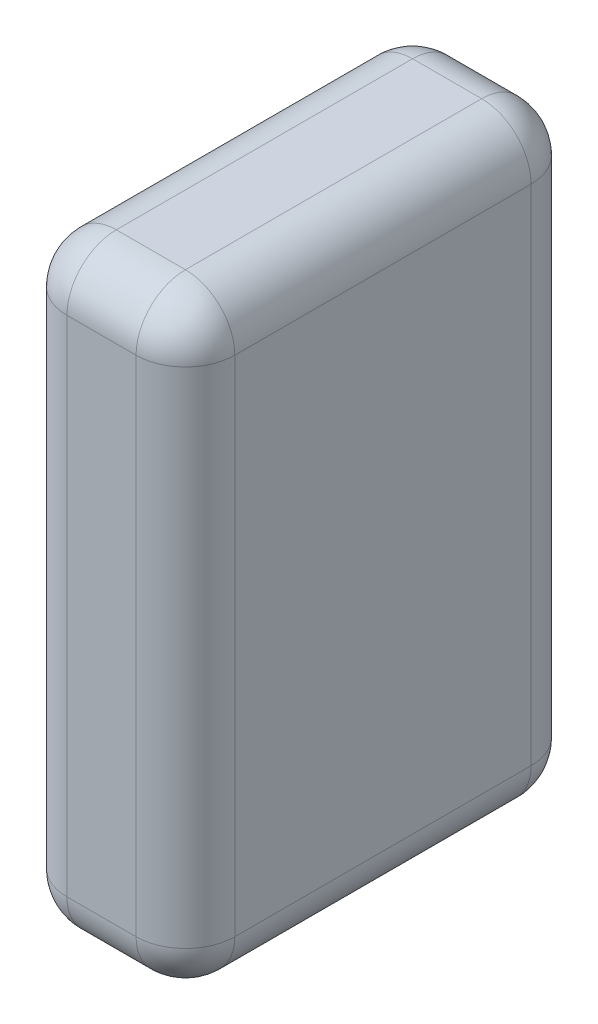
ISO-10303-21;
HEADER;
FILE_DESCRIPTION(('STEP AP214'),'2;1');
FILE_NAME('part.step','',(''),(''),'','','');
FILE_SCHEMA(('AUTOMOTIVE_DESIGN { 1 0 10303 214 1 1 1 1 }'));
ENDSEC;
DATA;
#1=APPLICATION_CONTEXT('core data for automotive mechanical design processes');
#2=APPLICATION_PROTOCOL_DEFINITION('international standard','automotive_design',2000,#1);
#3=PRODUCT_CONTEXT('',#1,'mechanical');
#4=PRODUCT('Part','Part','',(#3));
#5=PRODUCT_RELATED_PRODUCT_CATEGORY('part','',(#4));
#6=PRODUCT_DEFINITION_FORMATION('','',#4);
#7=PRODUCT_DEFINITION_CONTEXT('part definition',#1,'design');
#8=PRODUCT_DEFINITION('design','',#6,#7);
#9=PRODUCT_DEFINITION_SHAPE('','',#8);
#10=(LENGTH_UNIT() NAMED_UNIT(*) SI_UNIT(.MILLI.,.METRE.));
#11=(NAMED_UNIT(*) PLANE_ANGLE_UNIT() SI_UNIT($,.RADIAN.));
#12=(NAMED_UNIT(*) SI_UNIT($,.STERADIAN.) SOLID_ANGLE_UNIT());
#13=UNCERTAINTY_MEASURE_WITH_UNIT(LENGTH_MEASURE(1.E-05),#10,'distance_accuracy_value','');
#14=(GEOMETRIC_REPRESENTATION_CONTEXT(3) GLOBAL_UNCERTAINTY_ASSIGNED_CONTEXT((#13)) GLOBAL_UNIT_ASSIGNED_CONTEXT((#10,
#11,#12)) REPRESENTATION_CONTEXT('',''));
#15=CARTESIAN_POINT('',(0.,0.,0.));
#16=DIRECTION('',(0.,0.,1.));
#17=DIRECTION('',(1.,0.,0.));
#18=AXIS2_PLACEMENT_3D('',#15,#16,#17);
#19=CARTESIAN_POINT('',(-8.49999999999999,-30.5,40.));
#20=DIRECTION('',(1.,0.,0.));
#21=DIRECTION('',(0.,0.,-1.));
#22=AXIS2_PLACEMENT_3D('',#19,#20,#21);
#23=PLANE('',#22);
#24=DIRECTION('',(0.,0.,-1.));
#25=VECTOR('',#24,1.);
#26=CARTESIAN_POINT('',(-8.49999999999999,25.5,40.));
#27=LINE('',#26,#25);
#28=CARTESIAN_POINT('',(-8.49999999999999,25.5,35.));
#29=VERTEX_POINT('',#28);
#30=CARTESIAN_POINT('',(-8.49999999999999,25.5,5.));
#31=VERTEX_POINT('',#30);
#32=EDGE_CURVE('E146',#29,#31,#27,.T.);
#33=ORIENTED_EDGE('',*,*,#32,.T.);
#34=DIRECTION('',(0.,-1.,0.));
#35=VECTOR('',#34,1.);
#36=CARTESIAN_POINT('',(-8.49999999999999,-30.5,5.));
#37=LINE('',#36,#35);
#38=CARTESIAN_POINT('',(-8.49999999999999,-25.5,5.));
#39=VERTEX_POINT('',#38);
#40=EDGE_CURVE('E141',#31,#39,#37,.T.);
#41=ORIENTED_EDGE('',*,*,#40,.T.);
#42=DIRECTION('',(0.,0.,-1.));
#43=VECTOR('',#42,1.);
#44=CARTESIAN_POINT('',(-8.49999999999999,-25.5,40.));
#45=LINE('',#44,#43);
#46=CARTESIAN_POINT('',(-8.49999999999999,-25.5,35.));
#47=VERTEX_POINT('',#46);
#48=EDGE_CURVE('E136',#39,#47,#45,.F.);
#49=ORIENTED_EDGE('',*,*,#48,.T.);
#50=DIRECTION('',(0.,-1.,0.));
#51=VECTOR('',#50,1.);
#52=CARTESIAN_POINT('',(-8.49999999999999,30.5,35.));
#53=LINE('',#52,#51);
#54=EDGE_CURVE('E138',#47,#29,#53,.F.);
#55=ORIENTED_EDGE('',*,*,#54,.T.);
#56=EDGE_LOOP('',(#33,#41,#49,#55));
#57=FACE_BOUND('',#56,.T.);
#58=ADVANCED_FACE('F43',(#57),#23,.F.);
#59=CARTESIAN_POINT('',(8.50000000000001,-30.5,40.));
#60=DIRECTION('',(0.,1.,0.));
#61=DIRECTION('',(0.,0.,1.));
#62=AXIS2_PLACEMENT_3D('',#59,#60,#61);
#63=PLANE('',#62);
#64=DIRECTION('',(0.,0.,-1.));
#65=VECTOR('',#64,1.);
#66=CARTESIAN_POINT('',(3.50000000000001,-30.5,40.));
#67=LINE('',#66,#65);
#68=CARTESIAN_POINT('',(3.50000000000001,-30.5,5.));
#69=VERTEX_POINT('',#68);
#70=CARTESIAN_POINT('',(3.50000000000001,-30.5,35.));
#71=VERTEX_POINT('',#70);
#72=EDGE_CURVE('E314',#69,#71,#67,.F.);
#73=ORIENTED_EDGE('',*,*,#72,.T.);
#74=DIRECTION('',(1.,0.,0.));
#75=VECTOR('',#74,1.);
#76=CARTESIAN_POINT('',(-8.49999999999999,-30.5,35.));
#77=LINE('',#76,#75);
#78=CARTESIAN_POINT('',(-3.49999999999999,-30.5,35.));
#79=VERTEX_POINT('',#78);
#80=EDGE_CURVE('E319',#71,#79,#77,.F.);
#81=ORIENTED_EDGE('',*,*,#80,.T.);
#82=DIRECTION('',(0.,0.,-1.));
#83=VECTOR('',#82,1.);
#84=CARTESIAN_POINT('',(-3.49999999999999,-30.5,40.));
#85=LINE('',#84,#83);
#86=CARTESIAN_POINT('',(-3.49999999999999,-30.5,5.));
#87=VERTEX_POINT('',#86);
#88=EDGE_CURVE('E169',#79,#87,#85,.T.);
#89=ORIENTED_EDGE('',*,*,#88,.T.);
#90=DIRECTION('',(1.,0.,0.));
#91=VECTOR('',#90,1.);
#92=CARTESIAN_POINT('',(8.50000000000001,-30.5,5.));
#93=LINE('',#92,#91);
#94=EDGE_CURVE('E311',#87,#69,#93,.T.);
#95=ORIENTED_EDGE('',*,*,#94,.T.);
#96=EDGE_LOOP('',(#73,#81,#89,#95));
#97=FACE_BOUND('',#96,.T.);
#98=ADVANCED_FACE('F370',(#97),#63,.F.);
#99=CARTESIAN_POINT('',(8.50000000000001,-30.5,40.));
#100=DIRECTION('',(-1.,0.,0.));
#101=DIRECTION('',(0.,0.,1.));
#102=AXIS2_PLACEMENT_3D('',#99,#100,#101);
#103=PLANE('',#102);
#104=DIRECTION('',(0.,0.,-1.));
#105=VECTOR('',#104,1.);
#106=CARTESIAN_POINT('',(8.50000000000001,-25.5,40.));
#107=LINE('',#106,#105);
#108=CARTESIAN_POINT('',(8.50000000000001,-25.5,35.));
#109=VERTEX_POINT('',#108);
#110=CARTESIAN_POINT('',(8.50000000000001,-25.5,5.));
#111=VERTEX_POINT('',#110);
#112=EDGE_CURVE('E328',#109,#111,#107,.T.);
#113=ORIENTED_EDGE('',*,*,#112,.T.);
#114=DIRECTION('',(0.,1.,0.));
#115=VECTOR('',#114,1.);
#116=CARTESIAN_POINT('',(8.50000000000001,-30.5,5.));
#117=LINE('',#116,#115);
#118=CARTESIAN_POINT('',(8.50000000000001,25.5,5.));
#119=VERTEX_POINT('',#118);
#120=EDGE_CURVE('E332',#111,#119,#117,.T.);
#121=ORIENTED_EDGE('',*,*,#120,.T.);
#122=DIRECTION('',(0.,0.,-1.));
#123=VECTOR('',#122,1.);
#124=CARTESIAN_POINT('',(8.50000000000001,25.5,40.));
#125=LINE('',#124,#123);
#126=CARTESIAN_POINT('',(8.50000000000001,25.5,35.));
#127=VERTEX_POINT('',#126);
#128=EDGE_CURVE('E245',#119,#127,#125,.F.);
#129=ORIENTED_EDGE('',*,*,#128,.T.);
#130=DIRECTION('',(0.,1.,0.));
#131=VECTOR('',#130,1.);
#132=CARTESIAN_POINT('',(8.50000000000001,-30.5,35.));
#133=LINE('',#132,#131);
#134=EDGE_CURVE('E323',#127,#109,#133,.F.);
#135=ORIENTED_EDGE('',*,*,#134,.T.);
#136=EDGE_LOOP('',(#113,#121,#129,#135));
#137=FACE_BOUND('',#136,.T.);
#138=ADVANCED_FACE('F352',(#137),#103,.F.);
#139=CARTESIAN_POINT('',(8.50000000000001,30.5,40.));
#140=DIRECTION('',(0.,-1.,0.));
#141=DIRECTION('',(0.,0.,-1.));
#142=AXIS2_PLACEMENT_3D('',#139,#140,#141);
#143=PLANE('',#142);
#144=DIRECTION('',(0.,0.,-1.));
#145=VECTOR('',#144,1.);
#146=CARTESIAN_POINT('',(3.50000000000001,30.5,40.));
#147=LINE('',#146,#145);
#148=CARTESIAN_POINT('',(3.50000000000001,30.5,35.));
#149=VERTEX_POINT('',#148);
#150=CARTESIAN_POINT('',(3.50000000000001,30.5,5.));
#151=VERTEX_POINT('',#150);
#152=EDGE_CURVE('E53',#149,#151,#147,.T.);
#153=ORIENTED_EDGE('',*,*,#152,.T.);
#154=DIRECTION('',(-1.,0.,0.));
#155=VECTOR('',#154,1.);
#156=CARTESIAN_POINT('',(8.50000000000001,30.5,5.));
#157=LINE('',#156,#155);
#158=CARTESIAN_POINT('',(-3.5,30.5,5.));
#159=VERTEX_POINT('',#158);
#160=EDGE_CURVE('E11',#151,#159,#157,.T.);
#161=ORIENTED_EDGE('',*,*,#160,.T.);
#162=DIRECTION('',(0.,0.,-1.));
#163=VECTOR('',#162,1.);
#164=CARTESIAN_POINT('',(-3.49999999999999,30.5,40.));
#165=LINE('',#164,#163);
#166=CARTESIAN_POINT('',(-3.5,30.5,35.));
#167=VERTEX_POINT('',#166);
#168=EDGE_CURVE('E249',#159,#167,#165,.F.);
#169=ORIENTED_EDGE('',*,*,#168,.T.);
#170=DIRECTION('',(-1.,0.,0.));
#171=VECTOR('',#170,1.);
#172=CARTESIAN_POINT('',(8.50000000000001,30.5,35.));
#173=LINE('',#172,#171);
#174=EDGE_CURVE('E252',#167,#149,#173,.F.);
#175=ORIENTED_EDGE('',*,*,#174,.T.);
#176=EDGE_LOOP('',(#153,#161,#169,#175));
#177=FACE_BOUND('',#176,.T.);
#178=ADVANCED_FACE('F336',(#177),#143,.F.);
#179=CARTESIAN_POINT('',(0.,0.,40.));
#180=DIRECTION('',(0.,0.,1.));
#181=DIRECTION('',(1.,0.,0.));
#182=AXIS2_PLACEMENT_3D('',#179,#180,#181);
#183=PLANE('',#182);
#184=DIRECTION('',(0.,-1.,0.));
#185=VECTOR('',#184,1.);
#186=CARTESIAN_POINT('',(-3.5,-30.5,40.));
#187=LINE('',#186,#185);
#188=CARTESIAN_POINT('',(-3.5,25.5,40.));
#189=VERTEX_POINT('',#188);
#190=CARTESIAN_POINT('',(-3.5,-25.5,40.));
#191=VERTEX_POINT('',#190);
#192=EDGE_CURVE('E294',#189,#191,#187,.T.);
#193=ORIENTED_EDGE('',*,*,#192,.T.);
#194=DIRECTION('',(1.,0.,0.));
#195=VECTOR('',#194,1.);
#196=CARTESIAN_POINT('',(8.50000000000001,-25.5,40.));
#197=LINE('',#196,#195);
#198=CARTESIAN_POINT('',(3.50000000000001,-25.5,40.));
#199=VERTEX_POINT('',#198);
#200=EDGE_CURVE('E307',#191,#199,#197,.T.);
#201=ORIENTED_EDGE('',*,*,#200,.T.);
#202=DIRECTION('',(0.,1.,0.));
#203=VECTOR('',#202,1.);
#204=CARTESIAN_POINT('',(3.50000000000001,30.5,40.));
#205=LINE('',#204,#203);
#206=CARTESIAN_POINT('',(3.50000000000001,25.5,40.));
#207=VERTEX_POINT('',#206);
#208=EDGE_CURVE('E304',#199,#207,#205,.T.);
#209=ORIENTED_EDGE('',*,*,#208,.T.);
#210=DIRECTION('',(-1.,0.,0.));
#211=VECTOR('',#210,1.);
#212=CARTESIAN_POINT('',(-8.49999999999999,25.5,40.));
#213=LINE('',#212,#211);
#214=EDGE_CURVE('E298',#207,#189,#213,.T.);
#215=ORIENTED_EDGE('',*,*,#214,.T.);
#216=EDGE_LOOP('',(#193,#201,#209,#215));
#217=FACE_BOUND('',#216,.T.);
#218=ADVANCED_FACE('F341',(#217),#183,.T.);
#219=CARTESIAN_POINT('',(0.,0.,0.));
#220=DIRECTION('',(0.,0.,1.));
#221=DIRECTION('',(1.,0.,0.));
#222=AXIS2_PLACEMENT_3D('',#219,#220,#221);
#223=PLANE('',#222);
#224=DIRECTION('',(1.,0.,0.));
#225=VECTOR('',#224,1.);
#226=CARTESIAN_POINT('',(0.,-25.5,0.));
#227=LINE('',#226,#225);
#228=CARTESIAN_POINT('',(3.50000000000001,-25.5,0.));
#229=VERTEX_POINT('',#228);
#230=CARTESIAN_POINT('',(-3.5,-25.5,0.));
#231=VERTEX_POINT('',#230);
#232=EDGE_CURVE('E283',#229,#231,#227,.F.);
#233=ORIENTED_EDGE('',*,*,#232,.T.);
#234=DIRECTION('',(0.,-1.,0.));
#235=VECTOR('',#234,1.);
#236=CARTESIAN_POINT('',(-3.5,0.,0.));
#237=LINE('',#236,#235);
#238=CARTESIAN_POINT('',(-3.5,25.5,0.));
#239=VERTEX_POINT('',#238);
#240=EDGE_CURVE('E287',#231,#239,#237,.F.);
#241=ORIENTED_EDGE('',*,*,#240,.T.);
#242=DIRECTION('',(-1.,0.,0.));
#243=VECTOR('',#242,1.);
#244=CARTESIAN_POINT('',(0.,25.5,0.));
#245=LINE('',#244,#243);
#246=CARTESIAN_POINT('',(3.50000000000001,25.5,0.));
#247=VERTEX_POINT('',#246);
#248=EDGE_CURVE('E277',#239,#247,#245,.F.);
#249=ORIENTED_EDGE('',*,*,#248,.T.);
#250=DIRECTION('',(0.,1.,0.));
#251=VECTOR('',#250,1.);
#252=CARTESIAN_POINT('',(3.50000000000001,0.,0.));
#253=LINE('',#252,#251);
#254=EDGE_CURVE('E284',#247,#229,#253,.F.);
#255=ORIENTED_EDGE('',*,*,#254,.T.);
#256=EDGE_LOOP('',(#233,#241,#249,#255));
#257=FACE_BOUND('',#256,.T.);
#258=ADVANCED_FACE('F288',(#257),#223,.F.);
#259=CARTESIAN_POINT('',(3.50000000000001,0.,35.));
#260=DIRECTION('',(0.,-1.,0.));
#261=DIRECTION('',(0.,0.,-1.));
#262=AXIS2_PLACEMENT_3D('',#259,#260,#261);
#263=CYLINDRICAL_SURFACE('',#262,5.);
#264=CARTESIAN_POINT('',(3.50000000000001,25.5,35.));
#265=DIRECTION('',(0.,1.,0.));
#266=DIRECTION('',(0.,0.,1.));
#267=AXIS2_PLACEMENT_3D('',#264,#265,#266);
#268=CIRCLE('',#267,5.);
#269=EDGE_CURVE('E47',#207,#127,#268,.T.);
#270=ORIENTED_EDGE('',*,*,#269,.F.);
#271=ORIENTED_EDGE('',*,*,#208,.F.);
#272=CARTESIAN_POINT('',(3.50000000000001,-25.5,35.));
#273=DIRECTION('',(0.,-1.,0.));
#274=DIRECTION('',(0.,0.,-1.));
#275=AXIS2_PLACEMENT_3D('',#272,#273,#274);
#276=CIRCLE('',#275,5.);
#277=EDGE_CURVE('E224',#109,#199,#276,.T.);
#278=ORIENTED_EDGE('',*,*,#277,.F.);
#279=ORIENTED_EDGE('',*,*,#134,.F.);
#280=EDGE_LOOP('',(#270,#271,#278,#279));
#281=FACE_BOUND('',#280,.T.);
#282=ADVANCED_FACE('F45',(#281),#263,.T.);
#283=CARTESIAN_POINT('',(3.50000000000001,25.5,35.));
#284=DIRECTION('',(1.,0.,0.));
#285=DIRECTION('',(0.,0.,-1.));
#286=AXIS2_PLACEMENT_3D('',#283,#284,#285);
#287=SPHERICAL_SURFACE('',#286,5.);
#288=CARTESIAN_POINT('',(3.50000000000001,25.5,35.));
#289=DIRECTION('',(1.,0.,0.));
#290=DIRECTION('',(0.,0.,-1.));
#291=AXIS2_PLACEMENT_3D('',#288,#289,#290);
#292=CIRCLE('',#291,5.);
#293=EDGE_CURVE('E217',#207,#149,#292,.F.);
#294=ORIENTED_EDGE('',*,*,#293,.F.);
#295=ORIENTED_EDGE('',*,*,#269,.T.);
#296=CARTESIAN_POINT('',(3.50000000000001,25.5,35.));
#297=DIRECTION('',(0.,0.,1.));
#298=DIRECTION('',(1.,0.,0.));
#299=AXIS2_PLACEMENT_3D('',#296,#297,#298);
#300=CIRCLE('',#299,5.);
#301=EDGE_CURVE('E221',#149,#127,#300,.F.);
#302=ORIENTED_EDGE('',*,*,#301,.F.);
#303=EDGE_LOOP('',(#294,#295,#302));
#304=FACE_BOUND('',#303,.T.);
#305=ADVANCED_FACE('F238',(#304),#287,.T.);
#306=CARTESIAN_POINT('',(3.50000000000001,-25.5,35.));
#307=DIRECTION('',(0.,0.,1.));
#308=DIRECTION('',(1.,0.,0.));
#309=AXIS2_PLACEMENT_3D('',#306,#307,#308);
#310=SPHERICAL_SURFACE('',#309,5.);
#311=CARTESIAN_POINT('',(3.50000000000001,-25.5,35.));
#312=DIRECTION('',(0.,0.,1.));
#313=DIRECTION('',(1.,0.,0.));
#314=AXIS2_PLACEMENT_3D('',#311,#312,#313);
#315=CIRCLE('',#314,5.);
#316=EDGE_CURVE('E210',#109,#71,#315,.F.);
#317=ORIENTED_EDGE('',*,*,#316,.F.);
#318=ORIENTED_EDGE('',*,*,#277,.T.);
#319=CARTESIAN_POINT('',(3.50000000000001,-25.5,35.));
#320=DIRECTION('',(1.,0.,0.));
#321=DIRECTION('',(0.,0.,-1.));
#322=AXIS2_PLACEMENT_3D('',#319,#320,#321);
#323=CIRCLE('',#322,5.);
#324=EDGE_CURVE('E214',#71,#199,#323,.F.);
#325=ORIENTED_EDGE('',*,*,#324,.F.);
#326=EDGE_LOOP('',(#317,#318,#325));
#327=FACE_BOUND('',#326,.T.);
#328=ADVANCED_FACE('F344',(#327),#310,.T.);
#329=CARTESIAN_POINT('',(3.50000000000001,25.5,40.));
#330=DIRECTION('',(0.,0.,-1.));
#331=DIRECTION('',(-1.,0.,0.));
#332=AXIS2_PLACEMENT_3D('',#329,#330,#331);
#333=CYLINDRICAL_SURFACE('',#332,5.);
#334=ORIENTED_EDGE('',*,*,#301,.T.);
#335=ORIENTED_EDGE('',*,*,#128,.F.);
#336=CARTESIAN_POINT('',(3.50000000000001,25.5,5.));
#337=DIRECTION('',(0.,0.,-1.));
#338=DIRECTION('',(-1.,0.,0.));
#339=AXIS2_PLACEMENT_3D('',#336,#337,#338);
#340=CIRCLE('',#339,5.);
#341=EDGE_CURVE('E202',#151,#119,#340,.T.);
#342=ORIENTED_EDGE('',*,*,#341,.F.);
#343=ORIENTED_EDGE('',*,*,#152,.F.);
#344=EDGE_LOOP('',(#334,#335,#342,#343));
#345=FACE_BOUND('',#344,.T.);
#346=ADVANCED_FACE('F244',(#345),#333,.T.);
#347=CARTESIAN_POINT('',(0.,25.5,35.));
#348=DIRECTION('',(1.,0.,0.));
#349=DIRECTION('',(0.,0.,-1.));
#350=AXIS2_PLACEMENT_3D('',#347,#348,#349);
#351=CYLINDRICAL_SURFACE('',#350,5.);
#352=ORIENTED_EDGE('',*,*,#293,.T.);
#353=ORIENTED_EDGE('',*,*,#174,.F.);
#354=CARTESIAN_POINT('',(-3.5,25.5,35.));
#355=DIRECTION('',(-1.,0.,0.));
#356=DIRECTION('',(0.,0.,1.));
#357=AXIS2_PLACEMENT_3D('',#354,#355,#356);
#358=CIRCLE('',#357,5.);
#359=EDGE_CURVE('E198',#189,#167,#358,.T.);
#360=ORIENTED_EDGE('',*,*,#359,.F.);
#361=ORIENTED_EDGE('',*,*,#214,.F.);
#362=EDGE_LOOP('',(#352,#353,#360,#361));
#363=FACE_BOUND('',#362,.T.);
#364=ADVANCED_FACE('F339',(#363),#351,.T.);
#365=CARTESIAN_POINT('',(-3.5,0.,35.));
#366=DIRECTION('',(0.,1.,0.));
#367=DIRECTION('',(0.,0.,1.));
#368=AXIS2_PLACEMENT_3D('',#365,#366,#367);
#369=CYLINDRICAL_SURFACE('',#368,5.);
#370=CARTESIAN_POINT('',(-3.5,-25.5,35.));
#371=DIRECTION('',(0.,-1.,0.));
#372=DIRECTION('',(0.,0.,-1.));
#373=AXIS2_PLACEMENT_3D('',#370,#371,#372);
#374=CIRCLE('',#373,5.);
#375=EDGE_CURVE('E153',#191,#47,#374,.T.);
#376=ORIENTED_EDGE('',*,*,#375,.F.);
#377=ORIENTED_EDGE('',*,*,#192,.F.);
#378=CARTESIAN_POINT('',(-3.5,25.5,35.));
#379=DIRECTION('',(0.,1.,0.));
#380=DIRECTION('',(0.,0.,1.));
#381=AXIS2_PLACEMENT_3D('',#378,#379,#380);
#382=CIRCLE('',#381,5.);
#383=EDGE_CURVE('E156',#29,#189,#382,.T.);
#384=ORIENTED_EDGE('',*,*,#383,.F.);
#385=ORIENTED_EDGE('',*,*,#54,.F.);
#386=EDGE_LOOP('',(#376,#377,#384,#385));
#387=FACE_BOUND('',#386,.T.);
#388=ADVANCED_FACE('F151',(#387),#369,.T.);
#389=CARTESIAN_POINT('',(0.,-25.5,35.));
#390=DIRECTION('',(-1.,0.,0.));
#391=DIRECTION('',(0.,0.,1.));
#392=AXIS2_PLACEMENT_3D('',#389,#390,#391);
#393=CYLINDRICAL_SURFACE('',#392,5.);
#394=ORIENTED_EDGE('',*,*,#324,.T.);
#395=ORIENTED_EDGE('',*,*,#200,.F.);
#396=CARTESIAN_POINT('',(-3.49999999999999,-25.5,35.));
#397=DIRECTION('',(-1.,0.,0.));
#398=DIRECTION('',(0.,0.,1.));
#399=AXIS2_PLACEMENT_3D('',#396,#397,#398);
#400=CIRCLE('',#399,5.);
#401=EDGE_CURVE('E165',#79,#191,#400,.T.);
#402=ORIENTED_EDGE('',*,*,#401,.F.);
#403=ORIENTED_EDGE('',*,*,#80,.F.);
#404=EDGE_LOOP('',(#394,#395,#402,#403));
#405=FACE_BOUND('',#404,.T.);
#406=ADVANCED_FACE('F505',(#405),#393,.T.);
#407=CARTESIAN_POINT('',(3.50000000000001,-25.5,40.));
#408=DIRECTION('',(0.,0.,-1.));
#409=DIRECTION('',(-1.,0.,0.));
#410=AXIS2_PLACEMENT_3D('',#407,#408,#409);
#411=CYLINDRICAL_SURFACE('',#410,5.);
#412=ORIENTED_EDGE('',*,*,#316,.T.);
#413=ORIENTED_EDGE('',*,*,#72,.F.);
#414=CARTESIAN_POINT('',(3.50000000000001,-25.5,5.));
#415=DIRECTION('',(0.,0.,-1.));
#416=DIRECTION('',(-1.,0.,0.));
#417=AXIS2_PLACEMENT_3D('',#414,#415,#416);
#418=CIRCLE('',#417,5.);
#419=EDGE_CURVE('E190',#111,#69,#418,.T.);
#420=ORIENTED_EDGE('',*,*,#419,.F.);
#421=ORIENTED_EDGE('',*,*,#112,.F.);
#422=EDGE_LOOP('',(#412,#413,#420,#421));
#423=FACE_BOUND('',#422,.T.);
#424=ADVANCED_FACE('F349',(#423),#411,.T.);
#425=CARTESIAN_POINT('',(3.50000000000001,-30.5,5.));
#426=DIRECTION('',(0.,1.,0.));
#427=DIRECTION('',(0.,0.,1.));
#428=AXIS2_PLACEMENT_3D('',#425,#426,#427);
#429=CYLINDRICAL_SURFACE('',#428,5.);
#430=CARTESIAN_POINT('',(3.50000000000001,25.5,5.));
#431=DIRECTION('',(0.,1.,0.));
#432=DIRECTION('',(0.,0.,1.));
#433=AXIS2_PLACEMENT_3D('',#430,#431,#432);
#434=CIRCLE('',#433,5.);
#435=EDGE_CURVE('E206',#119,#247,#434,.T.);
#436=ORIENTED_EDGE('',*,*,#435,.F.);
#437=ORIENTED_EDGE('',*,*,#120,.F.);
#438=CARTESIAN_POINT('',(3.50000000000001,-25.5,5.));
#439=DIRECTION('',(0.,-1.,0.));
#440=DIRECTION('',(0.,0.,-1.));
#441=AXIS2_PLACEMENT_3D('',#438,#439,#440);
#442=CIRCLE('',#441,5.);
#443=EDGE_CURVE('E187',#229,#111,#442,.T.);
#444=ORIENTED_EDGE('',*,*,#443,.F.);
#445=ORIENTED_EDGE('',*,*,#254,.F.);
#446=EDGE_LOOP('',(#436,#437,#444,#445));
#447=FACE_BOUND('',#446,.T.);
#448=ADVANCED_FACE('F355',(#447),#429,.T.);
#449=CARTESIAN_POINT('',(3.50000000000001,25.5,5.));
#450=DIRECTION('',(1.,0.,0.));
#451=DIRECTION('',(0.,0.,-1.));
#452=AXIS2_PLACEMENT_3D('',#449,#450,#451);
#453=SPHERICAL_SURFACE('',#452,5.);
#454=ORIENTED_EDGE('',*,*,#341,.T.);
#455=ORIENTED_EDGE('',*,*,#435,.T.);
#456=CARTESIAN_POINT('',(3.50000000000001,25.5,5.));
#457=DIRECTION('',(1.,0.,0.));
#458=DIRECTION('',(0.,0.,-1.));
#459=AXIS2_PLACEMENT_3D('',#456,#457,#458);
#460=CIRCLE('',#459,5.);
#461=EDGE_CURVE('E177',#151,#247,#460,.F.);
#462=ORIENTED_EDGE('',*,*,#461,.F.);
#463=EDGE_LOOP('',(#454,#455,#462));
#464=FACE_BOUND('',#463,.T.);
#465=ADVANCED_FACE('F358',(#464),#453,.T.);
#466=CARTESIAN_POINT('',(-3.5,25.5,35.));
#467=DIRECTION('',(0.,0.,1.));
#468=DIRECTION('',(1.,0.,0.));
#469=AXIS2_PLACEMENT_3D('',#466,#467,#468);
#470=SPHERICAL_SURFACE('',#469,5.);
#471=ORIENTED_EDGE('',*,*,#383,.T.);
#472=ORIENTED_EDGE('',*,*,#359,.T.);
#473=CARTESIAN_POINT('',(-3.5,25.5,35.));
#474=DIRECTION('',(0.,0.,1.));
#475=DIRECTION('',(1.,0.,0.));
#476=AXIS2_PLACEMENT_3D('',#473,#474,#475);
#477=CIRCLE('',#476,5.);
#478=EDGE_CURVE('E171',#29,#167,#477,.F.);
#479=ORIENTED_EDGE('',*,*,#478,.F.);
#480=EDGE_LOOP('',(#471,#472,#479));
#481=FACE_BOUND('',#480,.T.);
#482=ADVANCED_FACE('F360',(#481),#470,.T.);
#483=CARTESIAN_POINT('',(-3.5,-25.5,35.));
#484=DIRECTION('',(0.,0.,1.));
#485=DIRECTION('',(1.,0.,0.));
#486=AXIS2_PLACEMENT_3D('',#483,#484,#485);
#487=SPHERICAL_SURFACE('',#486,5.);
#488=ORIENTED_EDGE('',*,*,#401,.T.);
#489=ORIENTED_EDGE('',*,*,#375,.T.);
#490=CARTESIAN_POINT('',(-3.5,-25.5,35.));
#491=DIRECTION('',(0.,0.,1.));
#492=DIRECTION('',(1.,0.,0.));
#493=AXIS2_PLACEMENT_3D('',#490,#491,#492);
#494=CIRCLE('',#493,5.);
#495=EDGE_CURVE('E163',#79,#47,#494,.F.);
#496=ORIENTED_EDGE('',*,*,#495,.F.);
#497=EDGE_LOOP('',(#488,#489,#496));
#498=FACE_BOUND('',#497,.T.);
#499=ADVANCED_FACE('F162',(#498),#487,.T.);
#500=CARTESIAN_POINT('',(3.50000000000001,-25.5,5.));
#501=DIRECTION('',(1.,0.,0.));
#502=DIRECTION('',(0.,0.,-1.));
#503=AXIS2_PLACEMENT_3D('',#500,#501,#502);
#504=SPHERICAL_SURFACE('',#503,5.);
#505=ORIENTED_EDGE('',*,*,#443,.T.);
#506=ORIENTED_EDGE('',*,*,#419,.T.);
#507=CARTESIAN_POINT('',(3.50000000000001,-25.5,5.));
#508=DIRECTION('',(1.,0.,0.));
#509=DIRECTION('',(0.,0.,-1.));
#510=AXIS2_PLACEMENT_3D('',#507,#508,#509);
#511=CIRCLE('',#510,5.);
#512=EDGE_CURVE('E172',#229,#69,#511,.F.);
#513=ORIENTED_EDGE('',*,*,#512,.F.);
#514=EDGE_LOOP('',(#505,#506,#513));
#515=FACE_BOUND('',#514,.T.);
#516=ADVANCED_FACE('F400',(#515),#504,.T.);
#517=CARTESIAN_POINT('',(8.50000000000001,25.5,5.));
#518=DIRECTION('',(-1.,0.,0.));
#519=DIRECTION('',(0.,0.,1.));
#520=AXIS2_PLACEMENT_3D('',#517,#518,#519);
#521=CYLINDRICAL_SURFACE('',#520,5.);
#522=ORIENTED_EDGE('',*,*,#461,.T.);
#523=ORIENTED_EDGE('',*,*,#248,.F.);
#524=CARTESIAN_POINT('',(-3.5,25.5,5.));
#525=DIRECTION('',(-1.,0.,0.));
#526=DIRECTION('',(0.,0.,1.));
#527=AXIS2_PLACEMENT_3D('',#524,#525,#526);
#528=CIRCLE('',#527,5.);
#529=EDGE_CURVE('E180',#159,#239,#528,.T.);
#530=ORIENTED_EDGE('',*,*,#529,.F.);
#531=ORIENTED_EDGE('',*,*,#160,.F.);
#532=EDGE_LOOP('',(#522,#523,#530,#531));
#533=FACE_BOUND('',#532,.T.);
#534=ADVANCED_FACE('F279',(#533),#521,.T.);
#535=CARTESIAN_POINT('',(-3.5,25.5,40.));
#536=DIRECTION('',(0.,0.,-1.));
#537=DIRECTION('',(-1.,0.,0.));
#538=AXIS2_PLACEMENT_3D('',#535,#536,#537);
#539=CYLINDRICAL_SURFACE('',#538,5.);
#540=ORIENTED_EDGE('',*,*,#478,.T.);
#541=ORIENTED_EDGE('',*,*,#168,.F.);
#542=CARTESIAN_POINT('',(-3.5,25.5,5.));
#543=DIRECTION('',(0.,0.,-1.));
#544=DIRECTION('',(-1.,0.,0.));
#545=AXIS2_PLACEMENT_3D('',#542,#543,#544);
#546=CIRCLE('',#545,5.);
#547=EDGE_CURVE('E67',#31,#159,#546,.T.);
#548=ORIENTED_EDGE('',*,*,#547,.F.);
#549=ORIENTED_EDGE('',*,*,#32,.F.);
#550=EDGE_LOOP('',(#540,#541,#548,#549));
#551=FACE_BOUND('',#550,.T.);
#552=ADVANCED_FACE('F394',(#551),#539,.T.);
#553=CARTESIAN_POINT('',(-3.49999999999999,-25.5,40.));
#554=DIRECTION('',(0.,0.,-1.));
#555=DIRECTION('',(-1.,0.,0.));
#556=AXIS2_PLACEMENT_3D('',#553,#554,#555);
#557=CYLINDRICAL_SURFACE('',#556,5.);
#558=ORIENTED_EDGE('',*,*,#495,.T.);
#559=ORIENTED_EDGE('',*,*,#48,.F.);
#560=CARTESIAN_POINT('',(-3.49999999999999,-25.5,5.));
#561=DIRECTION('',(0.,0.,-1.));
#562=DIRECTION('',(-1.,0.,0.));
#563=AXIS2_PLACEMENT_3D('',#560,#561,#562);
#564=CIRCLE('',#563,5.);
#565=EDGE_CURVE('E266',#87,#39,#564,.T.);
#566=ORIENTED_EDGE('',*,*,#565,.F.);
#567=ORIENTED_EDGE('',*,*,#88,.F.);
#568=EDGE_LOOP('',(#558,#559,#566,#567));
#569=FACE_BOUND('',#568,.T.);
#570=ADVANCED_FACE('F168',(#569),#557,.T.);
#571=CARTESIAN_POINT('',(8.50000000000001,-25.5,5.));
#572=DIRECTION('',(1.,0.,0.));
#573=DIRECTION('',(0.,0.,-1.));
#574=AXIS2_PLACEMENT_3D('',#571,#572,#573);
#575=CYLINDRICAL_SURFACE('',#574,5.);
#576=ORIENTED_EDGE('',*,*,#512,.T.);
#577=ORIENTED_EDGE('',*,*,#94,.F.);
#578=CARTESIAN_POINT('',(-3.5,-25.5,5.));
#579=DIRECTION('',(-1.,0.,0.));
#580=DIRECTION('',(0.,-1.,0.));
#581=AXIS2_PLACEMENT_3D('',#578,#579,#580);
#582=CIRCLE('',#581,5.);
#583=EDGE_CURVE('E262',#231,#87,#582,.T.);
#584=ORIENTED_EDGE('',*,*,#583,.F.);
#585=ORIENTED_EDGE('',*,*,#232,.F.);
#586=EDGE_LOOP('',(#576,#577,#584,#585));
#587=FACE_BOUND('',#586,.T.);
#588=ADVANCED_FACE('F388',(#587),#575,.T.);
#589=CARTESIAN_POINT('',(-3.5,25.5,5.));
#590=DIRECTION('',(0.,1.,0.));
#591=DIRECTION('',(0.,0.,1.));
#592=AXIS2_PLACEMENT_3D('',#589,#590,#591);
#593=SPHERICAL_SURFACE('',#592,5.);
#594=ORIENTED_EDGE('',*,*,#547,.T.);
#595=ORIENTED_EDGE('',*,*,#529,.T.);
#596=CARTESIAN_POINT('',(-3.5,25.5,5.));
#597=DIRECTION('',(0.,1.,0.));
#598=DIRECTION('',(-1.,0.,0.));
#599=AXIS2_PLACEMENT_3D('',#596,#597,#598);
#600=CIRCLE('',#599,5.);
#601=EDGE_CURVE('E259',#31,#239,#600,.F.);
#602=ORIENTED_EDGE('',*,*,#601,.F.);
#603=EDGE_LOOP('',(#594,#595,#602));
#604=FACE_BOUND('',#603,.T.);
#605=ADVANCED_FACE('F273',(#604),#593,.T.);
#606=CARTESIAN_POINT('',(-3.5,-25.5,5.));
#607=DIRECTION('',(0.,-1.,0.));
#608=DIRECTION('',(0.,0.,-1.));
#609=AXIS2_PLACEMENT_3D('',#606,#607,#608);
#610=SPHERICAL_SURFACE('',#609,5.);
#611=ORIENTED_EDGE('',*,*,#583,.T.);
#612=ORIENTED_EDGE('',*,*,#565,.T.);
#613=CARTESIAN_POINT('',(-3.5,-25.5,5.));
#614=DIRECTION('',(0.,-1.,0.));
#615=DIRECTION('',(0.,0.,-1.));
#616=AXIS2_PLACEMENT_3D('',#613,#614,#615);
#617=CIRCLE('',#616,5.);
#618=EDGE_CURVE('E256',#231,#39,#617,.F.);
#619=ORIENTED_EDGE('',*,*,#618,.F.);
#620=EDGE_LOOP('',(#611,#612,#619));
#621=FACE_BOUND('',#620,.T.);
#622=ADVANCED_FACE('F382',(#621),#610,.T.);
#623=CARTESIAN_POINT('',(-3.5,-30.5,5.));
#624=DIRECTION('',(0.,-1.,0.));
#625=DIRECTION('',(0.,0.,-1.));
#626=AXIS2_PLACEMENT_3D('',#623,#624,#625);
#627=CYLINDRICAL_SURFACE('',#626,5.);
#628=ORIENTED_EDGE('',*,*,#601,.T.);
#629=ORIENTED_EDGE('',*,*,#240,.F.);
#630=ORIENTED_EDGE('',*,*,#618,.T.);
#631=ORIENTED_EDGE('',*,*,#40,.F.);
#632=EDGE_LOOP('',(#628,#629,#630,#631));
#633=FACE_BOUND('',#632,.T.);
#634=ADVANCED_FACE('F379',(#633),#627,.T.);
#635=CLOSED_SHELL('',(#58,#98,#138,#178,#218,#258,#282,#305,#328,#346,#364,#388,#406,#424,#448,
#465,#482,#499,#516,#534,#552,#570,#588,#605,#622,#634));
#636=MANIFOLD_SOLID_BREP('B2',#635);
#637=ADVANCED_BREP_SHAPE_REPRESENTATION('',(#18,#636),#14);
#638=SHAPE_DEFINITION_REPRESENTATION(#9,#637);
ENDSEC;
END-ISO-10303-21;
